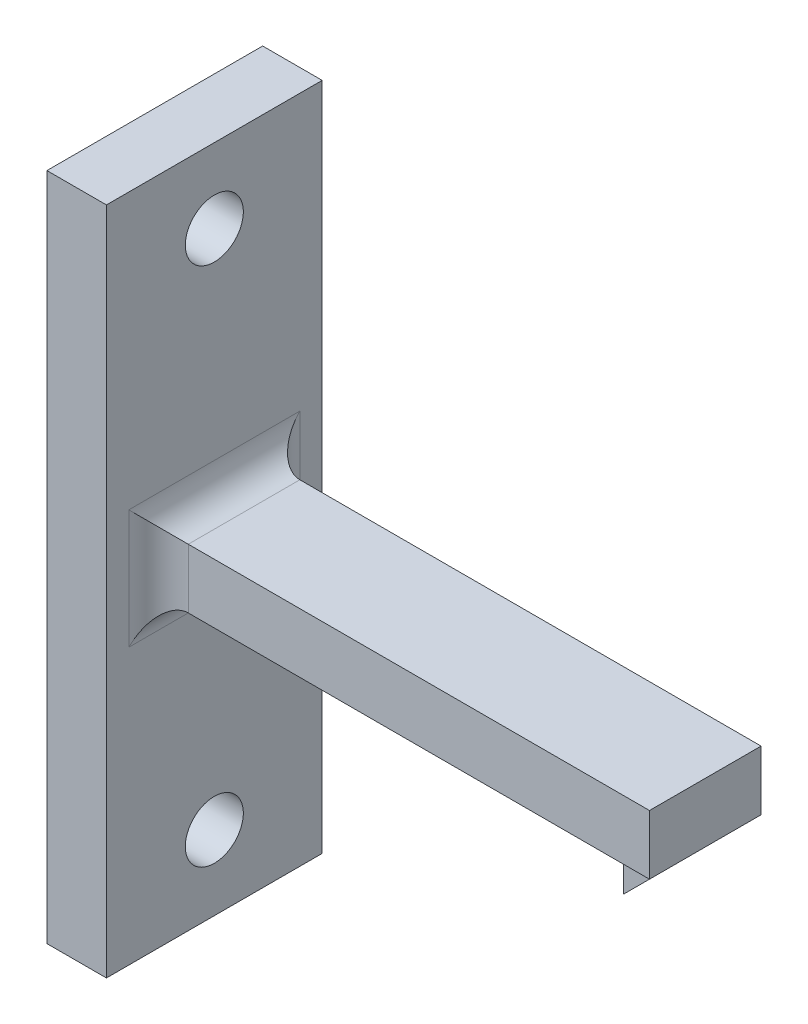
ISO-10303-21;
HEADER;
FILE_DESCRIPTION(('STEP AP214'),'2;1');
FILE_NAME('part.step','',(''),(''),'','','');
FILE_SCHEMA(('AUTOMOTIVE_DESIGN { 1 0 10303 214 1 1 1 1 }'));
ENDSEC;
DATA;
#1=APPLICATION_CONTEXT('core data for automotive mechanical design processes');
#2=APPLICATION_PROTOCOL_DEFINITION('international standard','automotive_design',2000,#1);
#3=PRODUCT_CONTEXT('',#1,'mechanical');
#4=PRODUCT('Part','Part','',(#3));
#5=PRODUCT_RELATED_PRODUCT_CATEGORY('part','',(#4));
#6=PRODUCT_DEFINITION_FORMATION('','',#4);
#7=PRODUCT_DEFINITION_CONTEXT('part definition',#1,'design');
#8=PRODUCT_DEFINITION('design','',#6,#7);
#9=PRODUCT_DEFINITION_SHAPE('','',#8);
#10=(LENGTH_UNIT() NAMED_UNIT(*) SI_UNIT(.MILLI.,.METRE.));
#11=(NAMED_UNIT(*) PLANE_ANGLE_UNIT() SI_UNIT($,.RADIAN.));
#12=(NAMED_UNIT(*) SI_UNIT($,.STERADIAN.) SOLID_ANGLE_UNIT());
#13=UNCERTAINTY_MEASURE_WITH_UNIT(LENGTH_MEASURE(1.E-05),#10,'distance_accuracy_value','');
#14=(GEOMETRIC_REPRESENTATION_CONTEXT(3) GLOBAL_UNCERTAINTY_ASSIGNED_CONTEXT((#13)) GLOBAL_UNIT_ASSIGNED_CONTEXT((#10,
#11,#12)) REPRESENTATION_CONTEXT('',''));
#15=CARTESIAN_POINT('',(0.,0.,0.));
#16=DIRECTION('',(0.,0.,1.));
#17=DIRECTION('',(1.,0.,0.));
#18=AXIS2_PLACEMENT_3D('',#15,#16,#17);
#19=CARTESIAN_POINT('',(0.,-1.99999999999996,-3.49999999999987));
#20=DIRECTION('',(0.,-1.,0.));
#21=DIRECTION('',(1.,0.,0.));
#22=AXIS2_PLACEMENT_3D('',#19,#20,#21);
#23=PLANE('',#22);
#24=DIRECTION('',(1.,0.,0.));
#25=VECTOR('',#24,1.);
#26=CARTESIAN_POINT('',(258.024077489567,-2.,1.25000000000013));
#27=LINE('',#26,#25);
#28=CARTESIAN_POINT('',(227.024077489567,-2.,1.25000000000013));
#29=VERTEX_POINT('',#28);
#30=CARTESIAN_POINT('',(258.024077489567,-2.,1.25000000000013));
#31=VERTEX_POINT('',#30);
#32=EDGE_CURVE('E222',#29,#31,#27,.T.);
#33=ORIENTED_EDGE('',*,*,#32,.F.);
#34=DIRECTION('',(0.,0.,1.));
#35=VECTOR('',#34,1.);
#36=CARTESIAN_POINT('',(227.024077489567,-2.,-6.24999999999987));
#37=LINE('',#36,#35);
#38=CARTESIAN_POINT('',(227.024077489567,-2.,-6.24999999999987));
#39=VERTEX_POINT('',#38);
#40=EDGE_CURVE('E268',#29,#39,#37,.F.);
#41=ORIENTED_EDGE('',*,*,#40,.T.);
#42=DIRECTION('',(-1.,0.,0.));
#43=VECTOR('',#42,1.);
#44=CARTESIAN_POINT('',(258.024077489567,-2.,-6.24999999999987));
#45=LINE('',#44,#43);
#46=CARTESIAN_POINT('',(258.024077489567,-2.,-6.24999999999987));
#47=VERTEX_POINT('',#46);
#48=EDGE_CURVE('E233',#47,#39,#45,.T.);
#49=ORIENTED_EDGE('',*,*,#48,.F.);
#50=DIRECTION('',(0.,0.,1.));
#51=VECTOR('',#50,1.);
#52=CARTESIAN_POINT('',(258.024077489567,-2.,-6.24999999999987));
#53=LINE('',#52,#51);
#54=CARTESIAN_POINT('',(258.024077489567,-2.,-3.99999999999988));
#55=VERTEX_POINT('',#54);
#56=EDGE_CURVE('E239',#47,#55,#53,.T.);
#57=ORIENTED_EDGE('',*,*,#56,.T.);
#58=DIRECTION('',(1.,0.,0.));
#59=VECTOR('',#58,1.);
#60=CARTESIAN_POINT('',(254.024077489567,-2.,-3.99999999999988));
#61=LINE('',#60,#59);
#62=CARTESIAN_POINT('',(254.024077489567,-2.,-3.99999999999988));
#63=VERTEX_POINT('',#62);
#64=EDGE_CURVE('E203',#63,#55,#61,.T.);
#65=ORIENTED_EDGE('',*,*,#64,.F.);
#66=DIRECTION('',(0.,0.,1.));
#67=VECTOR('',#66,1.);
#68=CARTESIAN_POINT('',(254.024077489567,-2.00000000000001,-3.49999999999987));
#69=LINE('',#68,#67);
#70=CARTESIAN_POINT('',(254.024077489567,-2.00000000000001,-0.999999999999875));
#71=VERTEX_POINT('',#70);
#72=EDGE_CURVE('E249',#63,#71,#69,.T.);
#73=ORIENTED_EDGE('',*,*,#72,.T.);
#74=DIRECTION('',(-1.,0.,0.));
#75=VECTOR('',#74,1.);
#76=CARTESIAN_POINT('',(258.024077489567,-2.,-0.999999999999875));
#77=LINE('',#76,#75);
#78=CARTESIAN_POINT('',(258.024077489567,-2.,-0.999999999999875));
#79=VERTEX_POINT('',#78);
#80=EDGE_CURVE('E185',#79,#71,#77,.T.);
#81=ORIENTED_EDGE('',*,*,#80,.F.);
#82=DIRECTION('',(0.,0.,-1.));
#83=VECTOR('',#82,1.);
#84=CARTESIAN_POINT('',(258.024077489567,-2.,1.25000000000013));
#85=LINE('',#84,#83);
#86=EDGE_CURVE('E225',#31,#79,#85,.T.);
#87=ORIENTED_EDGE('',*,*,#86,.F.);
#88=EDGE_LOOP('',(#33,#41,#49,#57,#65,#73,#81,#87));
#89=FACE_BOUND('',#88,.T.);
#90=ADVANCED_FACE('F60',(#89),#23,.T.);
#91=CARTESIAN_POINT('',(0.,1.99999999999996,-3.49999999999987));
#92=DIRECTION('',(0.,1.,0.));
#93=DIRECTION('',(-1.,0.,0.));
#94=AXIS2_PLACEMENT_3D('',#91,#92,#93);
#95=PLANE('',#94);
#96=DIRECTION('',(1.,0.,0.));
#97=VECTOR('',#96,1.);
#98=CARTESIAN_POINT('',(258.024077489567,1.99999999999986,-6.24999999999987));
#99=LINE('',#98,#97);
#100=CARTESIAN_POINT('',(227.024077489567,1.99999999999993,-6.24999999999987));
#101=VERTEX_POINT('',#100);
#102=CARTESIAN_POINT('',(258.024077489567,1.99999999999986,-6.24999999999987));
#103=VERTEX_POINT('',#102);
#104=EDGE_CURVE('E236',#101,#103,#99,.T.);
#105=ORIENTED_EDGE('',*,*,#104,.F.);
#106=DIRECTION('',(0.,0.,-1.));
#107=VECTOR('',#106,1.);
#108=CARTESIAN_POINT('',(227.024077489567,2.,1.25000000000013));
#109=LINE('',#108,#107);
#110=CARTESIAN_POINT('',(227.024077489567,2.,1.25000000000013));
#111=VERTEX_POINT('',#110);
#112=EDGE_CURVE('E70',#101,#111,#109,.F.);
#113=ORIENTED_EDGE('',*,*,#112,.T.);
#114=DIRECTION('',(-1.,0.,0.));
#115=VECTOR('',#114,1.);
#116=CARTESIAN_POINT('',(258.024077489567,2.,1.25000000000013));
#117=LINE('',#116,#115);
#118=CARTESIAN_POINT('',(258.024077489567,2.,1.25000000000013));
#119=VERTEX_POINT('',#118);
#120=EDGE_CURVE('E219',#119,#111,#117,.T.);
#121=ORIENTED_EDGE('',*,*,#120,.F.);
#122=DIRECTION('',(0.,0.,1.));
#123=VECTOR('',#122,1.);
#124=CARTESIAN_POINT('',(258.024077489567,2.,-3.49999999999987));
#125=LINE('',#124,#123);
#126=EDGE_CURVE('E252',#103,#119,#125,.T.);
#127=ORIENTED_EDGE('',*,*,#126,.F.);
#128=EDGE_LOOP('',(#105,#113,#121,#127));
#129=FACE_BOUND('',#128,.T.);
#130=ADVANCED_FACE('F344',(#129),#95,.T.);
#131=CARTESIAN_POINT('',(258.024077489567,2.,-3.49999999999987));
#132=DIRECTION('',(1.,0.,0.));
#133=DIRECTION('',(0.,0.,-1.));
#134=AXIS2_PLACEMENT_3D('',#131,#132,#133);
#135=PLANE('',#134);
#136=DIRECTION('',(0.,0.,-1.));
#137=VECTOR('',#136,1.);
#138=CARTESIAN_POINT('',(258.024077489567,-2.,-1.49999999999987));
#139=LINE('',#138,#137);
#140=EDGE_CURVE('E243',#79,#55,#139,.T.);
#141=ORIENTED_EDGE('',*,*,#140,.T.);
#142=ORIENTED_EDGE('',*,*,#56,.F.);
#143=DIRECTION('',(0.,-1.,0.));
#144=VECTOR('',#143,1.);
#145=CARTESIAN_POINT('',(258.024077489567,-2.,-6.24999999999987));
#146=LINE('',#145,#144);
#147=EDGE_CURVE('E229',#103,#47,#146,.T.);
#148=ORIENTED_EDGE('',*,*,#147,.F.);
#149=ORIENTED_EDGE('',*,*,#126,.T.);
#150=DIRECTION('',(0.,1.,0.));
#151=VECTOR('',#150,1.);
#152=CARTESIAN_POINT('',(258.024077489567,2.,1.25000000000013));
#153=LINE('',#152,#151);
#154=EDGE_CURVE('E215',#31,#119,#153,.T.);
#155=ORIENTED_EDGE('',*,*,#154,.F.);
#156=ORIENTED_EDGE('',*,*,#86,.T.);
#157=EDGE_LOOP('',(#141,#142,#148,#149,#155,#156));
#158=FACE_BOUND('',#157,.T.);
#159=ADVANCED_FACE('F351',(#158),#135,.T.);
#160=CARTESIAN_POINT('',(254.024077489567,2.,-1.49999999999987));
#161=DIRECTION('',(1.,0.,0.));
#162=DIRECTION('',(0.,0.,-1.));
#163=AXIS2_PLACEMENT_3D('',#160,#161,#162);
#164=PLANE('',#163);
#165=ORIENTED_EDGE('',*,*,#72,.F.);
#166=DIRECTION('',(0.,1.,0.));
#167=VECTOR('',#166,1.);
#168=CARTESIAN_POINT('',(254.024077489567,-6.,-3.99999999999988));
#169=LINE('',#168,#167);
#170=CARTESIAN_POINT('',(254.024077489567,-6.,-3.99999999999988));
#171=VERTEX_POINT('',#170);
#172=EDGE_CURVE('E211',#171,#63,#169,.T.);
#173=ORIENTED_EDGE('',*,*,#172,.F.);
#174=DIRECTION('',(0.,0.,-1.));
#175=VECTOR('',#174,1.);
#176=CARTESIAN_POINT('',(254.024077489567,-6.,-1.49999999999987));
#177=LINE('',#176,#175);
#178=CARTESIAN_POINT('',(254.024077489567,-6.,-0.999999999999875));
#179=VERTEX_POINT('',#178);
#180=EDGE_CURVE('E246',#179,#171,#177,.T.);
#181=ORIENTED_EDGE('',*,*,#180,.F.);
#182=DIRECTION('',(0.,-1.,0.));
#183=VECTOR('',#182,1.);
#184=CARTESIAN_POINT('',(254.024077489567,-2.00000000000001,-0.999999999999875));
#185=LINE('',#184,#183);
#186=EDGE_CURVE('E190',#71,#179,#185,.T.);
#187=ORIENTED_EDGE('',*,*,#186,.F.);
#188=EDGE_LOOP('',(#165,#173,#181,#187));
#189=FACE_BOUND('',#188,.T.);
#190=ADVANCED_FACE('F520',(#189),#164,.F.);
#191=CARTESIAN_POINT('',(258.024077489567,-2.,-1.49999999999987));
#192=DIRECTION('',(-0.707106781186547,0.707106781186548,0.));
#193=DIRECTION('',(-0.707106781186548,-0.707106781186547,0.));
#194=AXIS2_PLACEMENT_3D('',#191,#192,#193);
#195=PLANE('',#194);
#196=ORIENTED_EDGE('',*,*,#180,.T.);
#197=DIRECTION('',(-0.707106781186548,-0.707106781186547,0.));
#198=VECTOR('',#197,1.);
#199=CARTESIAN_POINT('',(258.024077489567,-2.,-3.99999999999988));
#200=LINE('',#199,#198);
#201=EDGE_CURVE('E207',#55,#171,#200,.T.);
#202=ORIENTED_EDGE('',*,*,#201,.F.);
#203=ORIENTED_EDGE('',*,*,#140,.F.);
#204=DIRECTION('',(0.707106781186547,0.707106781186548,0.));
#205=VECTOR('',#204,1.);
#206=CARTESIAN_POINT('',(254.024077489567,-6.,-0.999999999999875));
#207=LINE('',#206,#205);
#208=EDGE_CURVE('E199',#179,#79,#207,.T.);
#209=ORIENTED_EDGE('',*,*,#208,.F.);
#210=EDGE_LOOP('',(#196,#202,#203,#209));
#211=FACE_BOUND('',#210,.T.);
#212=ADVANCED_FACE('F510',(#211),#195,.F.);
#213=CARTESIAN_POINT('',(0.,0.,-6.24999999999987));
#214=DIRECTION('',(0.,0.,1.));
#215=DIRECTION('',(1.,0.,0.));
#216=AXIS2_PLACEMENT_3D('',#213,#214,#215);
#217=PLANE('',#216);
#218=ORIENTED_EDGE('',*,*,#48,.T.);
#219=DIRECTION('',(0.,1.,0.));
#220=VECTOR('',#219,1.);
#221=CARTESIAN_POINT('',(227.024077489567,0.,-6.24999999999987));
#222=LINE('',#221,#220);
#223=EDGE_CURVE('E13',#39,#101,#222,.T.);
#224=ORIENTED_EDGE('',*,*,#223,.T.);
#225=ORIENTED_EDGE('',*,*,#104,.T.);
#226=ORIENTED_EDGE('',*,*,#147,.T.);
#227=EDGE_LOOP('',(#218,#224,#225,#226));
#228=FACE_BOUND('',#227,.T.);
#229=ADVANCED_FACE('F500',(#228),#217,.F.);
#230=CARTESIAN_POINT('',(0.,0.,1.25000000000013));
#231=DIRECTION('',(0.,0.,-1.));
#232=DIRECTION('',(-1.,0.,0.));
#233=AXIS2_PLACEMENT_3D('',#230,#231,#232);
#234=PLANE('',#233);
#235=ORIENTED_EDGE('',*,*,#120,.T.);
#236=DIRECTION('',(0.,-1.,0.));
#237=VECTOR('',#236,1.);
#238=CARTESIAN_POINT('',(227.024077489567,0.,1.25000000000013));
#239=LINE('',#238,#237);
#240=EDGE_CURVE('E272',#111,#29,#239,.T.);
#241=ORIENTED_EDGE('',*,*,#240,.T.);
#242=ORIENTED_EDGE('',*,*,#32,.T.);
#243=ORIENTED_EDGE('',*,*,#154,.T.);
#244=EDGE_LOOP('',(#235,#241,#242,#243));
#245=FACE_BOUND('',#244,.T.);
#246=ADVANCED_FACE('F378',(#245),#234,.F.);
#247=CARTESIAN_POINT('',(0.,0.,-3.99999999999988));
#248=DIRECTION('',(0.,0.,1.));
#249=DIRECTION('',(1.,0.,0.));
#250=AXIS2_PLACEMENT_3D('',#247,#248,#249);
#251=PLANE('',#250);
#252=ORIENTED_EDGE('',*,*,#64,.T.);
#253=ORIENTED_EDGE('',*,*,#201,.T.);
#254=ORIENTED_EDGE('',*,*,#172,.T.);
#255=EDGE_LOOP('',(#252,#253,#254));
#256=FACE_BOUND('',#255,.T.);
#257=ADVANCED_FACE('F475',(#256),#251,.F.);
#258=CARTESIAN_POINT('',(0.,0.,-0.999999999999875));
#259=DIRECTION('',(0.,0.,1.));
#260=DIRECTION('',(1.,0.,0.));
#261=AXIS2_PLACEMENT_3D('',#258,#259,#260);
#262=PLANE('',#261);
#263=ORIENTED_EDGE('',*,*,#80,.T.);
#264=ORIENTED_EDGE('',*,*,#186,.T.);
#265=ORIENTED_EDGE('',*,*,#208,.T.);
#266=EDGE_LOOP('',(#263,#264,#265));
#267=FACE_BOUND('',#266,.T.);
#268=ADVANCED_FACE('F467',(#267),#262,.T.);
#269=CARTESIAN_POINT('',(221.024077489567,-22.5,4.75000000000012));
#270=DIRECTION('',(0.,0.,-1.));
#271=DIRECTION('',(-1.,0.,0.));
#272=AXIS2_PLACEMENT_3D('',#269,#270,#271);
#273=PLANE('',#272);
#274=DIRECTION('',(0.,1.,0.));
#275=VECTOR('',#274,1.);
#276=CARTESIAN_POINT('',(225.024077489567,-22.5,4.75000000000012));
#277=LINE('',#276,#275);
#278=CARTESIAN_POINT('',(225.024077489567,-22.5,4.75000000000012));
#279=VERTEX_POINT('',#278);
#280=CARTESIAN_POINT('',(225.024077489567,22.5,4.75000000000012));
#281=VERTEX_POINT('',#280);
#282=EDGE_CURVE('E183',#279,#281,#277,.T.);
#283=ORIENTED_EDGE('',*,*,#282,.T.);
#284=DIRECTION('',(1.,0.,0.));
#285=VECTOR('',#284,1.);
#286=CARTESIAN_POINT('',(221.024077489567,22.5,4.75000000000012));
#287=LINE('',#286,#285);
#288=CARTESIAN_POINT('',(221.024077489567,22.5,4.75000000000012));
#289=VERTEX_POINT('',#288);
#290=EDGE_CURVE('E161',#289,#281,#287,.T.);
#291=ORIENTED_EDGE('',*,*,#290,.F.);
#292=DIRECTION('',(0.,1.,0.));
#293=VECTOR('',#292,1.);
#294=CARTESIAN_POINT('',(221.024077489567,-22.5,4.75000000000012));
#295=LINE('',#294,#293);
#296=CARTESIAN_POINT('',(221.024077489567,-22.5,4.75000000000012));
#297=VERTEX_POINT('',#296);
#298=EDGE_CURVE('E169',#297,#289,#295,.T.);
#299=ORIENTED_EDGE('',*,*,#298,.F.);
#300=DIRECTION('',(1.,0.,0.));
#301=VECTOR('',#300,1.);
#302=CARTESIAN_POINT('',(221.024077489567,-22.5,4.75000000000012));
#303=LINE('',#302,#301);
#304=EDGE_CURVE('E311',#297,#279,#303,.T.);
#305=ORIENTED_EDGE('',*,*,#304,.T.);
#306=EDGE_LOOP('',(#283,#291,#299,#305));
#307=FACE_BOUND('',#306,.T.);
#308=ADVANCED_FACE('F181',(#307),#273,.F.);
#309=CARTESIAN_POINT('',(221.024077489567,22.5,-9.74999999999988));
#310=DIRECTION('',(0.,-1.,0.));
#311=DIRECTION('',(0.,0.,-1.));
#312=AXIS2_PLACEMENT_3D('',#309,#310,#311);
#313=PLANE('',#312);
#314=DIRECTION('',(0.,0.,-1.));
#315=VECTOR('',#314,1.);
#316=CARTESIAN_POINT('',(225.024077489567,22.5,-9.74999999999988));
#317=LINE('',#316,#315);
#318=CARTESIAN_POINT('',(225.024077489567,22.5,-9.74999999999988));
#319=VERTEX_POINT('',#318);
#320=EDGE_CURVE('E314',#281,#319,#317,.T.);
#321=ORIENTED_EDGE('',*,*,#320,.T.);
#322=DIRECTION('',(1.,0.,0.));
#323=VECTOR('',#322,1.);
#324=CARTESIAN_POINT('',(221.024077489567,22.5,-9.74999999999988));
#325=LINE('',#324,#323);
#326=CARTESIAN_POINT('',(221.024077489567,22.5,-9.74999999999988));
#327=VERTEX_POINT('',#326);
#328=EDGE_CURVE('E164',#327,#319,#325,.T.);
#329=ORIENTED_EDGE('',*,*,#328,.F.);
#330=DIRECTION('',(0.,0.,-1.));
#331=VECTOR('',#330,1.);
#332=CARTESIAN_POINT('',(221.024077489567,22.5,-9.74999999999988));
#333=LINE('',#332,#331);
#334=EDGE_CURVE('E157',#289,#327,#333,.T.);
#335=ORIENTED_EDGE('',*,*,#334,.F.);
#336=ORIENTED_EDGE('',*,*,#290,.T.);
#337=EDGE_LOOP('',(#321,#329,#335,#336));
#338=FACE_BOUND('',#337,.T.);
#339=ADVANCED_FACE('F159',(#338),#313,.F.);
#340=CARTESIAN_POINT('',(221.024077489567,-22.5,-9.74999999999988));
#341=DIRECTION('',(0.,0.,1.));
#342=DIRECTION('',(1.,0.,0.));
#343=AXIS2_PLACEMENT_3D('',#340,#341,#342);
#344=PLANE('',#343);
#345=DIRECTION('',(0.,-1.,0.));
#346=VECTOR('',#345,1.);
#347=CARTESIAN_POINT('',(225.024077489567,-22.5,-9.74999999999988));
#348=LINE('',#347,#346);
#349=CARTESIAN_POINT('',(225.024077489567,-22.5,-9.74999999999988));
#350=VERTEX_POINT('',#349);
#351=EDGE_CURVE('E318',#319,#350,#348,.T.);
#352=ORIENTED_EDGE('',*,*,#351,.T.);
#353=DIRECTION('',(1.,0.,0.));
#354=VECTOR('',#353,1.);
#355=CARTESIAN_POINT('',(221.024077489567,-22.5,-9.74999999999988));
#356=LINE('',#355,#354);
#357=CARTESIAN_POINT('',(221.024077489567,-22.5,-9.74999999999988));
#358=VERTEX_POINT('',#357);
#359=EDGE_CURVE('E192',#358,#350,#356,.T.);
#360=ORIENTED_EDGE('',*,*,#359,.F.);
#361=DIRECTION('',(0.,-1.,0.));
#362=VECTOR('',#361,1.);
#363=CARTESIAN_POINT('',(221.024077489567,-22.5,-9.74999999999988));
#364=LINE('',#363,#362);
#365=EDGE_CURVE('E168',#327,#358,#364,.T.);
#366=ORIENTED_EDGE('',*,*,#365,.F.);
#367=ORIENTED_EDGE('',*,*,#328,.T.);
#368=EDGE_LOOP('',(#352,#360,#366,#367));
#369=FACE_BOUND('',#368,.T.);
#370=ADVANCED_FACE('F334',(#369),#344,.F.);
#371=CARTESIAN_POINT('',(221.024077489567,-22.5,-9.74999999999988));
#372=DIRECTION('',(0.,1.,0.));
#373=DIRECTION('',(0.,0.,1.));
#374=AXIS2_PLACEMENT_3D('',#371,#372,#373);
#375=PLANE('',#374);
#376=DIRECTION('',(0.,0.,1.));
#377=VECTOR('',#376,1.);
#378=CARTESIAN_POINT('',(225.024077489567,-22.5,-9.74999999999988));
#379=LINE('',#378,#377);
#380=EDGE_CURVE('E179',#350,#279,#379,.T.);
#381=ORIENTED_EDGE('',*,*,#380,.T.);
#382=ORIENTED_EDGE('',*,*,#304,.F.);
#383=DIRECTION('',(0.,0.,1.));
#384=VECTOR('',#383,1.);
#385=CARTESIAN_POINT('',(221.024077489567,-22.5,-9.74999999999988));
#386=LINE('',#385,#384);
#387=EDGE_CURVE('E174',#358,#297,#386,.T.);
#388=ORIENTED_EDGE('',*,*,#387,.F.);
#389=ORIENTED_EDGE('',*,*,#359,.T.);
#390=EDGE_LOOP('',(#381,#382,#388,#389));
#391=FACE_BOUND('',#390,.T.);
#392=ADVANCED_FACE('F329',(#391),#375,.F.);
#393=CARTESIAN_POINT('',(221.024077489567,0.,0.));
#394=DIRECTION('',(1.,0.,0.));
#395=DIRECTION('',(0.,0.,-1.));
#396=AXIS2_PLACEMENT_3D('',#393,#394,#395);
#397=PLANE('',#396);
#398=CARTESIAN_POINT('',(221.024077489567,17.5,-2.49999999999987));
#399=DIRECTION('',(-1.,0.,0.));
#400=DIRECTION('',(0.,0.,1.));
#401=AXIS2_PLACEMENT_3D('',#398,#399,#400);
#402=CIRCLE('',#401,1.95);
#403=CARTESIAN_POINT('',(221.024077489567,17.5,-0.549999999999875));
#404=VERTEX_POINT('',#403);
#405=EDGE_CURVE('E303',#404,#404,#402,.T.);
#406=ORIENTED_EDGE('',*,*,#405,.F.);
#407=EDGE_LOOP('',(#406));
#408=FACE_BOUND('',#407,.T.);
#409=CARTESIAN_POINT('',(221.024077489567,-17.5,-2.49999999999987));
#410=DIRECTION('',(-1.,0.,0.));
#411=DIRECTION('',(0.,0.,1.));
#412=AXIS2_PLACEMENT_3D('',#409,#410,#411);
#413=CIRCLE('',#412,1.95);
#414=CARTESIAN_POINT('',(221.024077489567,-17.5,-0.549999999999875));
#415=VERTEX_POINT('',#414);
#416=EDGE_CURVE('E297',#415,#415,#413,.T.);
#417=ORIENTED_EDGE('',*,*,#416,.F.);
#418=EDGE_LOOP('',(#417));
#419=FACE_BOUND('',#418,.T.);
#420=ORIENTED_EDGE('',*,*,#298,.T.);
#421=ORIENTED_EDGE('',*,*,#334,.T.);
#422=ORIENTED_EDGE('',*,*,#365,.T.);
#423=ORIENTED_EDGE('',*,*,#387,.T.);
#424=EDGE_LOOP('',(#420,#421,#422,#423));
#425=FACE_BOUND('',#424,.T.);
#426=ADVANCED_FACE('F172',(#408,#419,#425),#397,.F.);
#427=CARTESIAN_POINT('',(225.024077489567,0.,0.));
#428=DIRECTION('',(1.,0.,0.));
#429=DIRECTION('',(0.,0.,-1.));
#430=AXIS2_PLACEMENT_3D('',#427,#428,#429);
#431=PLANE('',#430);
#432=DIRECTION('',(0.,1.,0.));
#433=VECTOR('',#432,1.);
#434=CARTESIAN_POINT('',(225.024077489567,0.,-8.24999999999988));
#435=LINE('',#434,#433);
#436=CARTESIAN_POINT('',(225.024077489567,4.,-8.24999999999988));
#437=VERTEX_POINT('',#436);
#438=CARTESIAN_POINT('',(225.024077489567,-4.,-8.24999999999988));
#439=VERTEX_POINT('',#438);
#440=EDGE_CURVE('E255',#437,#439,#435,.F.);
#441=ORIENTED_EDGE('',*,*,#440,.T.);
#442=DIRECTION('',(0.,0.,1.));
#443=VECTOR('',#442,1.);
#444=CARTESIAN_POINT('',(225.024077489567,-4.,1.25000000000013));
#445=LINE('',#444,#443);
#446=CARTESIAN_POINT('',(225.024077489567,-4.,3.25000000000013));
#447=VERTEX_POINT('',#446);
#448=EDGE_CURVE('E264',#439,#447,#445,.T.);
#449=ORIENTED_EDGE('',*,*,#448,.T.);
#450=DIRECTION('',(0.,-1.,0.));
#451=VECTOR('',#450,1.);
#452=CARTESIAN_POINT('',(225.024077489567,0.,3.25000000000013));
#453=LINE('',#452,#451);
#454=CARTESIAN_POINT('',(225.024077489567,4.,3.25000000000013));
#455=VERTEX_POINT('',#454);
#456=EDGE_CURVE('E261',#447,#455,#453,.F.);
#457=ORIENTED_EDGE('',*,*,#456,.T.);
#458=DIRECTION('',(0.,0.,-1.));
#459=VECTOR('',#458,1.);
#460=CARTESIAN_POINT('',(225.024077489567,4.,-6.24999999999987));
#461=LINE('',#460,#459);
#462=EDGE_CURVE('E258',#455,#437,#461,.T.);
#463=ORIENTED_EDGE('',*,*,#462,.T.);
#464=EDGE_LOOP('',(#441,#449,#457,#463));
#465=FACE_BOUND('',#464,.T.);
#466=CARTESIAN_POINT('',(225.024077489567,17.5,-2.49999999999987));
#467=DIRECTION('',(-1.,0.,0.));
#468=DIRECTION('',(0.,0.,1.));
#469=AXIS2_PLACEMENT_3D('',#466,#467,#468);
#470=CIRCLE('',#469,1.95);
#471=CARTESIAN_POINT('',(225.024077489567,17.5,-0.549999999999875));
#472=VERTEX_POINT('',#471);
#473=EDGE_CURVE('E315',#472,#472,#470,.T.);
#474=ORIENTED_EDGE('',*,*,#473,.T.);
#475=EDGE_LOOP('',(#474));
#476=FACE_BOUND('',#475,.T.);
#477=CARTESIAN_POINT('',(225.024077489567,-17.5,-2.49999999999987));
#478=DIRECTION('',(-1.,0.,0.));
#479=DIRECTION('',(0.,0.,1.));
#480=AXIS2_PLACEMENT_3D('',#477,#478,#479);
#481=CIRCLE('',#480,1.95);
#482=CARTESIAN_POINT('',(225.024077489567,-17.5,-0.549999999999875));
#483=VERTEX_POINT('',#482);
#484=EDGE_CURVE('E291',#483,#483,#481,.T.);
#485=ORIENTED_EDGE('',*,*,#484,.T.);
#486=EDGE_LOOP('',(#485));
#487=FACE_BOUND('',#486,.T.);
#488=ORIENTED_EDGE('',*,*,#282,.F.);
#489=ORIENTED_EDGE('',*,*,#380,.F.);
#490=ORIENTED_EDGE('',*,*,#351,.F.);
#491=ORIENTED_EDGE('',*,*,#320,.F.);
#492=EDGE_LOOP('',(#488,#489,#490,#491));
#493=FACE_BOUND('',#492,.T.);
#494=ADVANCED_FACE('F333',(#465,#476,#487,#493),#431,.T.);
#495=CARTESIAN_POINT('',(225.024077489567,-17.5,-2.49999999999987));
#496=DIRECTION('',(-1.,0.,0.));
#497=DIRECTION('',(0.,0.,1.));
#498=AXIS2_PLACEMENT_3D('',#495,#496,#497);
#499=CYLINDRICAL_SURFACE('',#498,1.95);
#500=ORIENTED_EDGE('',*,*,#484,.F.);
#501=EDGE_LOOP('',(#500));
#502=FACE_BOUND('',#501,.T.);
#503=ORIENTED_EDGE('',*,*,#416,.T.);
#504=EDGE_LOOP('',(#503));
#505=FACE_BOUND('',#504,.T.);
#506=ADVANCED_FACE('F372',(#502,#505),#499,.F.);
#507=CARTESIAN_POINT('',(225.024077489567,17.5,-2.49999999999987));
#508=DIRECTION('',(-1.,0.,0.));
#509=DIRECTION('',(0.,0.,1.));
#510=AXIS2_PLACEMENT_3D('',#507,#508,#509);
#511=CYLINDRICAL_SURFACE('',#510,1.95);
#512=ORIENTED_EDGE('',*,*,#473,.F.);
#513=EDGE_LOOP('',(#512));
#514=FACE_BOUND('',#513,.T.);
#515=ORIENTED_EDGE('',*,*,#405,.T.);
#516=EDGE_LOOP('',(#515));
#517=FACE_BOUND('',#516,.T.);
#518=ADVANCED_FACE('F367',(#514,#517),#511,.F.);
#519=CARTESIAN_POINT('',(227.024077489567,4.,0.));
#520=DIRECTION('',(0.,0.,1.));
#521=DIRECTION('',(1.,0.,0.));
#522=AXIS2_PLACEMENT_3D('',#519,#520,#521);
#523=CYLINDRICAL_SURFACE('',#522,2.);
#524=CARTESIAN_POINT('',(227.024077489567,4.,3.25000000000013));
#525=DIRECTION('',(0.,-0.707106781186547,0.707106781186547));
#526=DIRECTION('',(0.,0.707106781186547,0.707106781186547));
#527=AXIS2_PLACEMENT_3D('',#524,#525,#526);
#528=ELLIPSE('',#527,2.82842712474619,2.);
#529=EDGE_CURVE('E282',#111,#455,#528,.F.);
#530=ORIENTED_EDGE('',*,*,#529,.F.);
#531=ORIENTED_EDGE('',*,*,#112,.F.);
#532=CARTESIAN_POINT('',(227.024077489567,4.,-8.24999999999988));
#533=DIRECTION('',(0.,0.707106781186547,0.707106781186547));
#534=DIRECTION('',(0.,0.707106781186547,-0.707106781186547));
#535=AXIS2_PLACEMENT_3D('',#532,#533,#534);
#536=ELLIPSE('',#535,2.82842712474619,2.);
#537=EDGE_CURVE('E64',#437,#101,#536,.T.);
#538=ORIENTED_EDGE('',*,*,#537,.F.);
#539=ORIENTED_EDGE('',*,*,#462,.F.);
#540=EDGE_LOOP('',(#530,#531,#538,#539));
#541=FACE_BOUND('',#540,.T.);
#542=ADVANCED_FACE('F62',(#541),#523,.F.);
#543=CARTESIAN_POINT('',(227.024077489567,0.,-8.24999999999988));
#544=DIRECTION('',(0.,1.,0.));
#545=DIRECTION('',(0.,0.,1.));
#546=AXIS2_PLACEMENT_3D('',#543,#544,#545);
#547=CYLINDRICAL_SURFACE('',#546,2.);
#548=ORIENTED_EDGE('',*,*,#537,.T.);
#549=ORIENTED_EDGE('',*,*,#223,.F.);
#550=CARTESIAN_POINT('',(227.024077489567,-4.,-8.24999999999988));
#551=DIRECTION('',(0.,0.707106781186547,-0.707106781186547));
#552=DIRECTION('',(0.,0.707106781186547,0.707106781186547));
#553=AXIS2_PLACEMENT_3D('',#550,#551,#552);
#554=ELLIPSE('',#553,2.82842712474619,2.);
#555=EDGE_CURVE('E280',#439,#39,#554,.T.);
#556=ORIENTED_EDGE('',*,*,#555,.F.);
#557=ORIENTED_EDGE('',*,*,#440,.F.);
#558=EDGE_LOOP('',(#548,#549,#556,#557));
#559=FACE_BOUND('',#558,.T.);
#560=ADVANCED_FACE('F362',(#559),#547,.F.);
#561=CARTESIAN_POINT('',(227.024077489567,0.,3.25000000000013));
#562=DIRECTION('',(0.,-1.,0.));
#563=DIRECTION('',(0.,0.,-1.));
#564=AXIS2_PLACEMENT_3D('',#561,#562,#563);
#565=CYLINDRICAL_SURFACE('',#564,2.);
#566=ORIENTED_EDGE('',*,*,#529,.T.);
#567=ORIENTED_EDGE('',*,*,#456,.F.);
#568=CARTESIAN_POINT('',(227.024077489567,-4.,3.25000000000013));
#569=DIRECTION('',(0.,-0.707106781186547,-0.707106781186547));
#570=DIRECTION('',(0.,-0.707106781186547,0.707106781186547));
#571=AXIS2_PLACEMENT_3D('',#568,#569,#570);
#572=ELLIPSE('',#571,2.82842712474619,2.);
#573=EDGE_CURVE('E277',#29,#447,#572,.F.);
#574=ORIENTED_EDGE('',*,*,#573,.F.);
#575=ORIENTED_EDGE('',*,*,#240,.F.);
#576=EDGE_LOOP('',(#566,#567,#574,#575));
#577=FACE_BOUND('',#576,.T.);
#578=ADVANCED_FACE('F359',(#577),#565,.F.);
#579=CARTESIAN_POINT('',(227.024077489567,-4.,0.));
#580=DIRECTION('',(0.,0.,-1.));
#581=DIRECTION('',(-1.,0.,0.));
#582=AXIS2_PLACEMENT_3D('',#579,#580,#581);
#583=CYLINDRICAL_SURFACE('',#582,2.);
#584=ORIENTED_EDGE('',*,*,#555,.T.);
#585=ORIENTED_EDGE('',*,*,#40,.F.);
#586=ORIENTED_EDGE('',*,*,#573,.T.);
#587=ORIENTED_EDGE('',*,*,#448,.F.);
#588=EDGE_LOOP('',(#584,#585,#586,#587));
#589=FACE_BOUND('',#588,.T.);
#590=ADVANCED_FACE('F356',(#589),#583,.F.);
#591=CLOSED_SHELL('',(#90,#130,#159,#190,#212,#229,#246,#257,#268,#308,#339,#370,#392,#426,#494,
#506,#518,#542,#560,#578,#590));
#592=MANIFOLD_SOLID_BREP('B2',#591);
#593=ADVANCED_BREP_SHAPE_REPRESENTATION('',(#18,#592),#14);
#594=SHAPE_DEFINITION_REPRESENTATION(#9,#593);
ENDSEC;
END-ISO-10303-21;
